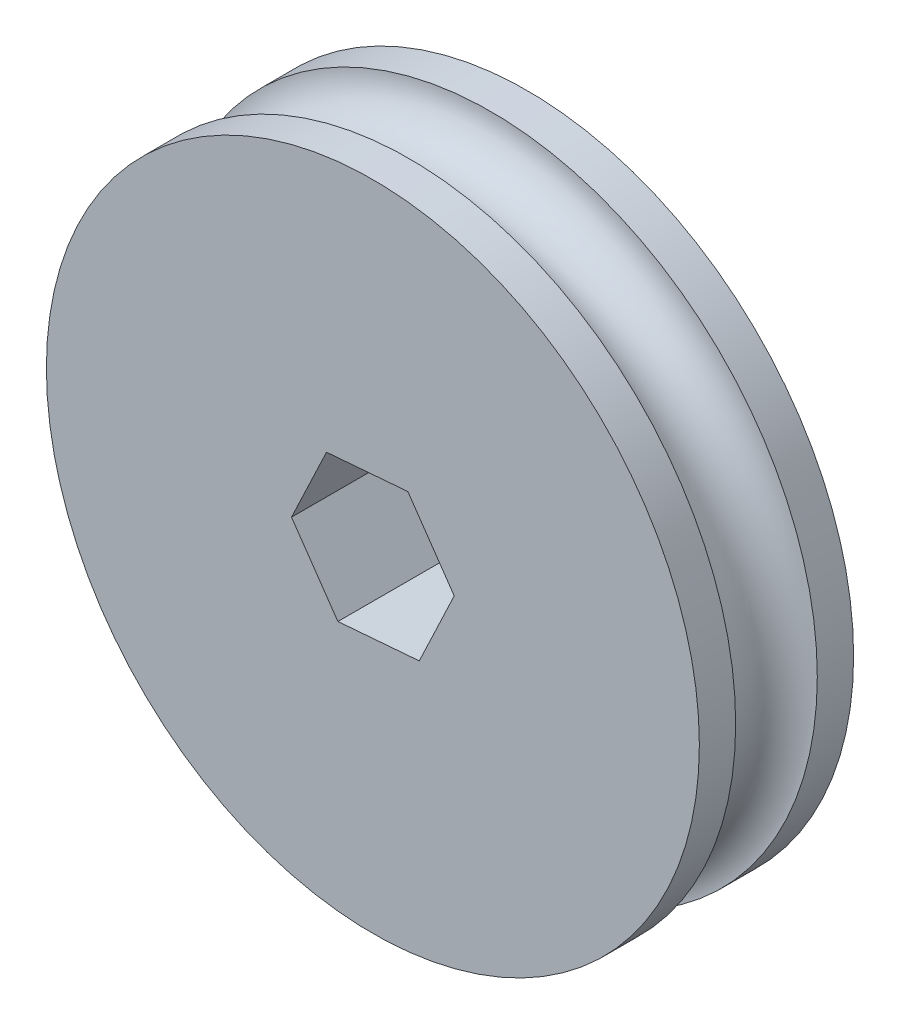
ISO-10303-21;
HEADER;
FILE_DESCRIPTION(('STEP AP214'),'2;1');
FILE_NAME('part.step','',(''),(''),'','','');
FILE_SCHEMA(('AUTOMOTIVE_DESIGN { 1 0 10303 214 1 1 1 1 }'));
ENDSEC;
DATA;
#1=APPLICATION_CONTEXT('core data for automotive mechanical design processes');
#2=APPLICATION_PROTOCOL_DEFINITION('international standard','automotive_design',2000,#1);
#3=PRODUCT_CONTEXT('',#1,'mechanical');
#4=PRODUCT('Part','Part','',(#3));
#5=PRODUCT_RELATED_PRODUCT_CATEGORY('part','',(#4));
#6=PRODUCT_DEFINITION_FORMATION('','',#4);
#7=PRODUCT_DEFINITION_CONTEXT('part definition',#1,'design');
#8=PRODUCT_DEFINITION('design','',#6,#7);
#9=PRODUCT_DEFINITION_SHAPE('','',#8);
#10=(LENGTH_UNIT() NAMED_UNIT(*) SI_UNIT(.MILLI.,.METRE.));
#11=(NAMED_UNIT(*) PLANE_ANGLE_UNIT() SI_UNIT($,.RADIAN.));
#12=(NAMED_UNIT(*) SI_UNIT($,.STERADIAN.) SOLID_ANGLE_UNIT());
#13=UNCERTAINTY_MEASURE_WITH_UNIT(LENGTH_MEASURE(1.E-05),#10,'distance_accuracy_value','');
#14=(GEOMETRIC_REPRESENTATION_CONTEXT(3) GLOBAL_UNCERTAINTY_ASSIGNED_CONTEXT((#13)) GLOBAL_UNIT_ASSIGNED_CONTEXT((#10,
#11,#12)) REPRESENTATION_CONTEXT('',''));
#15=CARTESIAN_POINT('',(0.,0.,0.));
#16=DIRECTION('',(0.,0.,1.));
#17=DIRECTION('',(1.,0.,0.));
#18=AXIS2_PLACEMENT_3D('',#15,#16,#17);
#19=CARTESIAN_POINT('',(0.,0.,0.));
#20=DIRECTION('',(0.,0.,1.));
#21=DIRECTION('',(1.,0.,0.));
#22=AXIS2_PLACEMENT_3D('',#19,#20,#21);
#23=CYLINDRICAL_SURFACE('',#22,25.4);
#24=CARTESIAN_POINT('',(0.,0.,-12.));
#25=DIRECTION('',(0.,0.,1.));
#26=DIRECTION('',(1.,0.,0.));
#27=AXIS2_PLACEMENT_3D('',#24,#25,#26);
#28=CIRCLE('',#27,25.4);
#29=CARTESIAN_POINT('',(25.4,0.,-12.));
#30=VERTEX_POINT('',#29);
#31=EDGE_CURVE('E11',#30,#30,#28,.T.);
#32=ORIENTED_EDGE('',*,*,#31,.T.);
#33=EDGE_LOOP('',(#32));
#34=FACE_BOUND('',#33,.T.);
#35=CARTESIAN_POINT('',(0.,0.,-9.175));
#36=DIRECTION('',(0.,0.,1.));
#37=DIRECTION('',(1.,0.,0.));
#38=AXIS2_PLACEMENT_3D('',#35,#36,#37);
#39=CIRCLE('',#38,25.4);
#40=CARTESIAN_POINT('',(25.4,0.,-9.175));
#41=VERTEX_POINT('',#40);
#42=EDGE_CURVE('E119',#41,#41,#39,.T.);
#43=ORIENTED_EDGE('',*,*,#42,.F.);
#44=EDGE_LOOP('',(#43));
#45=FACE_BOUND('',#44,.T.);
#46=ADVANCED_FACE('F33',(#34,#45),#23,.T.);
#47=CARTESIAN_POINT('',(12.7,0.,-12.));
#48=DIRECTION('',(0.,0.,-1.));
#49=DIRECTION('',(-1.,0.,0.));
#50=AXIS2_PLACEMENT_3D('',#47,#48,#49);
#51=PLANE('',#50);
#52=ORIENTED_EDGE('',*,*,#31,.F.);
#53=EDGE_LOOP('',(#52));
#54=FACE_BOUND('',#53,.T.);
#55=DIRECTION('',(0.568331299856394,-0.822799813808645,0.));
#56=VECTOR('',#55,1.);
#57=CARTESIAN_POINT('',(-6.33009323523293,-0.513081832256393,-12.));
#58=LINE('',#57,#56);
#59=CARTESIAN_POINT('',(-6.33009323523293,-0.513081832256393,-12.));
#60=VERTEX_POINT('',#59);
#61=CARTESIAN_POINT('',(-2.72070471666217,-5.73856246616394,-12.));
#62=VERTEX_POINT('',#61);
#63=EDGE_CURVE('E243',#60,#62,#58,.T.);
#64=ORIENTED_EDGE('',*,*,#63,.T.);
#65=DIRECTION('',(0.99673119091559,0.0807894365371458,0.));
#66=VECTOR('',#65,1.);
#67=CARTESIAN_POINT('',(-2.72070471666217,-5.73856246616394,-12.));
#68=LINE('',#67,#66);
#69=CARTESIAN_POINT('',(3.60938851857077,-5.22548063390755,-12.));
#70=VERTEX_POINT('',#69);
#71=EDGE_CURVE('E105',#62,#70,#68,.T.);
#72=ORIENTED_EDGE('',*,*,#71,.T.);
#73=DIRECTION('',(0.428399891059196,0.903589250345791,0.));
#74=VECTOR('',#73,1.);
#75=CARTESIAN_POINT('',(3.60938851857077,-5.22548063390755,-12.));
#76=LINE('',#75,#74);
#77=CARTESIAN_POINT('',(6.33009323523293,0.513081832256393,-12.));
#78=VERTEX_POINT('',#77);
#79=EDGE_CURVE('E103',#70,#78,#76,.T.);
#80=ORIENTED_EDGE('',*,*,#79,.T.);
#81=DIRECTION('',(-0.568331299856394,0.822799813808646,0.));
#82=VECTOR('',#81,1.);
#83=CARTESIAN_POINT('',(6.33009323523293,0.513081832256393,-12.));
#84=LINE('',#83,#82);
#85=CARTESIAN_POINT('',(2.72070471666217,5.73856246616394,-12.));
#86=VERTEX_POINT('',#85);
#87=EDGE_CURVE('E89',#78,#86,#84,.T.);
#88=ORIENTED_EDGE('',*,*,#87,.T.);
#89=DIRECTION('',(-0.99673119091559,-0.0807894365371455,0.));
#90=VECTOR('',#89,1.);
#91=CARTESIAN_POINT('',(2.72070471666217,5.73856246616394,-12.));
#92=LINE('',#91,#90);
#93=CARTESIAN_POINT('',(-3.60938851857077,5.22548063390755,-12.));
#94=VERTEX_POINT('',#93);
#95=EDGE_CURVE('E82',#86,#94,#92,.T.);
#96=ORIENTED_EDGE('',*,*,#95,.T.);
#97=DIRECTION('',(-0.428399891059196,-0.903589250345791,0.));
#98=VECTOR('',#97,1.);
#99=CARTESIAN_POINT('',(-3.60938851857077,5.22548063390755,-12.));
#100=LINE('',#99,#98);
#101=EDGE_CURVE('E88',#94,#60,#100,.T.);
#102=ORIENTED_EDGE('',*,*,#101,.T.);
#103=EDGE_LOOP('',(#64,#72,#80,#88,#96,#102));
#104=FACE_BOUND('',#103,.T.);
#105=ADVANCED_FACE('F101',(#54,#104),#51,.T.);
#106=CARTESIAN_POINT('',(12.7,0.,0.));
#107=DIRECTION('',(0.,0.,1.));
#108=DIRECTION('',(1.,0.,0.));
#109=AXIS2_PLACEMENT_3D('',#106,#107,#108);
#110=PLANE('',#109);
#111=CARTESIAN_POINT('',(0.,0.,0.));
#112=DIRECTION('',(0.,0.,1.));
#113=DIRECTION('',(1.,0.,0.));
#114=AXIS2_PLACEMENT_3D('',#111,#112,#113);
#115=CIRCLE('',#114,25.4);
#116=CARTESIAN_POINT('',(25.4,0.,0.));
#117=VERTEX_POINT('',#116);
#118=EDGE_CURVE('E40',#117,#117,#115,.T.);
#119=ORIENTED_EDGE('',*,*,#118,.T.);
#120=EDGE_LOOP('',(#119));
#121=FACE_BOUND('',#120,.T.);
#122=DIRECTION('',(0.99673119091559,0.0807894365371458,0.));
#123=VECTOR('',#122,1.);
#124=CARTESIAN_POINT('',(-2.72070471666217,-5.73856246616394,0.));
#125=LINE('',#124,#123);
#126=CARTESIAN_POINT('',(-2.72070471666217,-5.73856246616394,0.));
#127=VERTEX_POINT('',#126);
#128=CARTESIAN_POINT('',(3.60938851857077,-5.22548063390755,0.));
#129=VERTEX_POINT('',#128);
#130=EDGE_CURVE('E111',#127,#129,#125,.T.);
#131=ORIENTED_EDGE('',*,*,#130,.F.);
#132=DIRECTION('',(0.568331299856394,-0.822799813808645,0.));
#133=VECTOR('',#132,1.);
#134=CARTESIAN_POINT('',(-6.33009323523293,-0.513081832256393,0.));
#135=LINE('',#134,#133);
#136=CARTESIAN_POINT('',(-6.33009323523293,-0.513081832256393,0.));
#137=VERTEX_POINT('',#136);
#138=EDGE_CURVE('E114',#137,#127,#135,.T.);
#139=ORIENTED_EDGE('',*,*,#138,.F.);
#140=DIRECTION('',(-0.428399891059196,-0.903589250345791,0.));
#141=VECTOR('',#140,1.);
#142=CARTESIAN_POINT('',(-3.60938851857077,5.22548063390755,0.));
#143=LINE('',#142,#141);
#144=CARTESIAN_POINT('',(-3.60938851857077,5.22548063390755,0.));
#145=VERTEX_POINT('',#144);
#146=EDGE_CURVE('E98',#145,#137,#143,.T.);
#147=ORIENTED_EDGE('',*,*,#146,.F.);
#148=DIRECTION('',(-0.99673119091559,-0.0807894365371455,0.));
#149=VECTOR('',#148,1.);
#150=CARTESIAN_POINT('',(2.72070471666217,5.73856246616394,0.));
#151=LINE('',#150,#149);
#152=CARTESIAN_POINT('',(2.72070471666217,5.73856246616394,0.));
#153=VERTEX_POINT('',#152);
#154=EDGE_CURVE('E97',#153,#145,#151,.T.);
#155=ORIENTED_EDGE('',*,*,#154,.F.);
#156=DIRECTION('',(-0.568331299856394,0.822799813808646,0.));
#157=VECTOR('',#156,1.);
#158=CARTESIAN_POINT('',(6.33009323523293,0.513081832256393,0.));
#159=LINE('',#158,#157);
#160=CARTESIAN_POINT('',(6.33009323523293,0.513081832256393,0.));
#161=VERTEX_POINT('',#160);
#162=EDGE_CURVE('E95',#161,#153,#159,.T.);
#163=ORIENTED_EDGE('',*,*,#162,.F.);
#164=DIRECTION('',(0.428399891059196,0.903589250345791,0.));
#165=VECTOR('',#164,1.);
#166=CARTESIAN_POINT('',(3.60938851857077,-5.22548063390755,0.));
#167=LINE('',#166,#165);
#168=EDGE_CURVE('E118',#129,#161,#167,.T.);
#169=ORIENTED_EDGE('',*,*,#168,.F.);
#170=EDGE_LOOP('',(#131,#139,#147,#155,#163,#169));
#171=FACE_BOUND('',#170,.T.);
#172=ADVANCED_FACE('F127',(#121,#171),#110,.T.);
#173=CARTESIAN_POINT('',(0.,0.,0.));
#174=DIRECTION('',(0.,0.,1.));
#175=DIRECTION('',(1.,0.,0.));
#176=AXIS2_PLACEMENT_3D('',#173,#174,#175);
#177=CYLINDRICAL_SURFACE('',#176,25.4);
#178=CARTESIAN_POINT('',(0.,0.,-2.825));
#179=DIRECTION('',(0.,0.,1.));
#180=DIRECTION('',(1.,0.,0.));
#181=AXIS2_PLACEMENT_3D('',#178,#179,#180);
#182=CIRCLE('',#181,25.4);
#183=CARTESIAN_POINT('',(25.4,0.,-2.825));
#184=VERTEX_POINT('',#183);
#185=EDGE_CURVE('E122',#184,#184,#182,.T.);
#186=ORIENTED_EDGE('',*,*,#185,.T.);
#187=EDGE_LOOP('',(#186));
#188=FACE_BOUND('',#187,.T.);
#189=ORIENTED_EDGE('',*,*,#118,.F.);
#190=EDGE_LOOP('',(#189));
#191=FACE_BOUND('',#190,.T.);
#192=ADVANCED_FACE('F130',(#188,#191),#177,.T.);
#193=CARTESIAN_POINT('',(0.,0.,-6.));
#194=DIRECTION('',(0.,0.,1.));
#195=DIRECTION('',(1.,0.,0.));
#196=AXIS2_PLACEMENT_3D('',#193,#194,#195);
#197=TOROIDAL_SURFACE('',#196,25.4,3.175);
#198=ORIENTED_EDGE('',*,*,#42,.T.);
#199=EDGE_LOOP('',(#198));
#200=FACE_BOUND('',#199,.T.);
#201=ORIENTED_EDGE('',*,*,#185,.F.);
#202=EDGE_LOOP('',(#201));
#203=FACE_BOUND('',#202,.T.);
#204=ADVANCED_FACE('F132',(#200,#203),#197,.F.);
#205=CARTESIAN_POINT('',(-2.72070471666217,-5.73856246616394,-47.9210244842766));
#206=DIRECTION('',(0.0807894365371458,-0.99673119091559,0.));
#207=DIRECTION('',(0.99673119091559,0.0807894365371458,0.));
#208=AXIS2_PLACEMENT_3D('',#205,#206,#207);
#209=PLANE('',#208);
#210=ORIENTED_EDGE('',*,*,#71,.F.);
#211=DIRECTION('',(0.,0.,1.));
#212=VECTOR('',#211,1.);
#213=CARTESIAN_POINT('',(-2.72070471666217,-5.73856246616394,-47.9210244842766));
#214=LINE('',#213,#212);
#215=EDGE_CURVE('E109',#62,#127,#214,.T.);
#216=ORIENTED_EDGE('',*,*,#215,.T.);
#217=ORIENTED_EDGE('',*,*,#130,.T.);
#218=DIRECTION('',(0.,0.,1.));
#219=VECTOR('',#218,1.);
#220=CARTESIAN_POINT('',(3.60938851857077,-5.22548063390755,-47.9210244842766));
#221=LINE('',#220,#219);
#222=EDGE_CURVE('E53',#70,#129,#221,.T.);
#223=ORIENTED_EDGE('',*,*,#222,.F.);
#224=EDGE_LOOP('',(#210,#216,#217,#223));
#225=FACE_BOUND('',#224,.T.);
#226=ADVANCED_FACE('F139',(#225),#209,.F.);
#227=CARTESIAN_POINT('',(-6.33009323523293,-0.513081832256393,-47.9210244842766));
#228=DIRECTION('',(-0.822799813808646,-0.568331299856394,0.));
#229=DIRECTION('',(0.568331299856394,-0.822799813808645,0.));
#230=AXIS2_PLACEMENT_3D('',#227,#228,#229);
#231=PLANE('',#230);
#232=ORIENTED_EDGE('',*,*,#63,.F.);
#233=DIRECTION('',(0.,0.,1.));
#234=VECTOR('',#233,1.);
#235=CARTESIAN_POINT('',(-6.33009323523293,-0.513081832256393,-47.9210244842766));
#236=LINE('',#235,#234);
#237=EDGE_CURVE('E112',#60,#137,#236,.T.);
#238=ORIENTED_EDGE('',*,*,#237,.T.);
#239=ORIENTED_EDGE('',*,*,#138,.T.);
#240=ORIENTED_EDGE('',*,*,#215,.F.);
#241=EDGE_LOOP('',(#232,#238,#239,#240));
#242=FACE_BOUND('',#241,.T.);
#243=ADVANCED_FACE('F168',(#242),#231,.F.);
#244=CARTESIAN_POINT('',(-3.60938851857077,5.22548063390755,-47.9210244842766));
#245=DIRECTION('',(-0.903589250345791,0.428399891059196,0.));
#246=DIRECTION('',(-0.428399891059196,-0.903589250345791,0.));
#247=AXIS2_PLACEMENT_3D('',#244,#245,#246);
#248=PLANE('',#247);
#249=ORIENTED_EDGE('',*,*,#101,.F.);
#250=DIRECTION('',(0.,0.,1.));
#251=VECTOR('',#250,1.);
#252=CARTESIAN_POINT('',(-3.60938851857077,5.22548063390755,-47.9210244842766));
#253=LINE('',#252,#251);
#254=EDGE_CURVE('E84',#94,#145,#253,.T.);
#255=ORIENTED_EDGE('',*,*,#254,.T.);
#256=ORIENTED_EDGE('',*,*,#146,.T.);
#257=ORIENTED_EDGE('',*,*,#237,.F.);
#258=EDGE_LOOP('',(#249,#255,#256,#257));
#259=FACE_BOUND('',#258,.T.);
#260=ADVANCED_FACE('F176',(#259),#248,.F.);
#261=CARTESIAN_POINT('',(2.72070471666217,5.73856246616394,-47.9210244842766));
#262=DIRECTION('',(-0.0807894365371455,0.99673119091559,0.));
#263=DIRECTION('',(-0.99673119091559,-0.0807894365371455,0.));
#264=AXIS2_PLACEMENT_3D('',#261,#262,#263);
#265=PLANE('',#264);
#266=ORIENTED_EDGE('',*,*,#95,.F.);
#267=DIRECTION('',(0.,0.,1.));
#268=VECTOR('',#267,1.);
#269=CARTESIAN_POINT('',(2.72070471666217,5.73856246616394,-47.9210244842766));
#270=LINE('',#269,#268);
#271=EDGE_CURVE('E78',#86,#153,#270,.T.);
#272=ORIENTED_EDGE('',*,*,#271,.T.);
#273=ORIENTED_EDGE('',*,*,#154,.T.);
#274=ORIENTED_EDGE('',*,*,#254,.F.);
#275=EDGE_LOOP('',(#266,#272,#273,#274));
#276=FACE_BOUND('',#275,.T.);
#277=ADVANCED_FACE('F83',(#276),#265,.F.);
#278=CARTESIAN_POINT('',(6.33009323523293,0.513081832256393,-47.9210244842766));
#279=DIRECTION('',(0.822799813808645,0.568331299856394,0.));
#280=DIRECTION('',(-0.568331299856394,0.822799813808646,0.));
#281=AXIS2_PLACEMENT_3D('',#278,#279,#280);
#282=PLANE('',#281);
#283=ORIENTED_EDGE('',*,*,#87,.F.);
#284=DIRECTION('',(0.,0.,1.));
#285=VECTOR('',#284,1.);
#286=CARTESIAN_POINT('',(6.33009323523293,0.513081832256393,-47.9210244842766));
#287=LINE('',#286,#285);
#288=EDGE_CURVE('E47',#78,#161,#287,.T.);
#289=ORIENTED_EDGE('',*,*,#288,.T.);
#290=ORIENTED_EDGE('',*,*,#162,.T.);
#291=ORIENTED_EDGE('',*,*,#271,.F.);
#292=EDGE_LOOP('',(#283,#289,#290,#291));
#293=FACE_BOUND('',#292,.T.);
#294=ADVANCED_FACE('F92',(#293),#282,.F.);
#295=CARTESIAN_POINT('',(3.60938851857077,-5.22548063390755,-47.9210244842766));
#296=DIRECTION('',(0.903589250345791,-0.428399891059196,0.));
#297=DIRECTION('',(0.428399891059196,0.903589250345791,0.));
#298=AXIS2_PLACEMENT_3D('',#295,#296,#297);
#299=PLANE('',#298);
#300=ORIENTED_EDGE('',*,*,#79,.F.);
#301=ORIENTED_EDGE('',*,*,#222,.T.);
#302=ORIENTED_EDGE('',*,*,#168,.T.);
#303=ORIENTED_EDGE('',*,*,#288,.F.);
#304=EDGE_LOOP('',(#300,#301,#302,#303));
#305=FACE_BOUND('',#304,.T.);
#306=ADVANCED_FACE('F197',(#305),#299,.F.);
#307=CLOSED_SHELL('',(#46,#105,#172,#192,#204,#226,#243,#260,#277,#294,#306));
#308=MANIFOLD_SOLID_BREP('B2',#307);
#309=ADVANCED_BREP_SHAPE_REPRESENTATION('',(#18,#308),#14);
#310=SHAPE_DEFINITION_REPRESENTATION(#9,#309);
ENDSEC;
END-ISO-10303-21;
